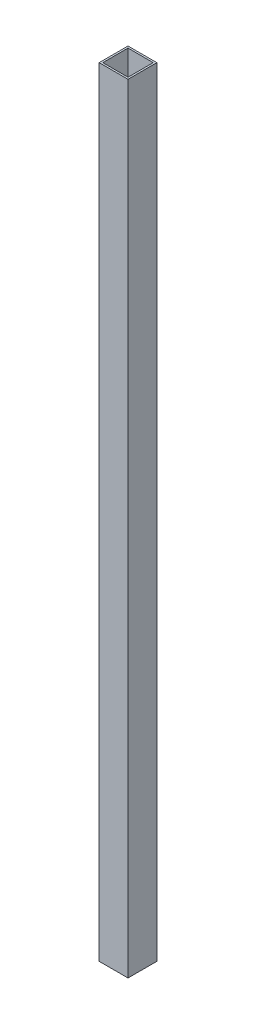
ISO-10303-21;
HEADER;
FILE_DESCRIPTION(('STEP AP214'),'2;1');
FILE_NAME('part.step','',(''),(''),'','','');
FILE_SCHEMA(('AUTOMOTIVE_DESIGN { 1 0 10303 214 1 1 1 1 }'));
ENDSEC;
DATA;
#1=APPLICATION_CONTEXT('core data for automotive mechanical design processes');
#2=APPLICATION_PROTOCOL_DEFINITION('international standard','automotive_design',2000,#1);
#3=PRODUCT_CONTEXT('',#1,'mechanical');
#4=PRODUCT('Part','Part','',(#3));
#5=PRODUCT_RELATED_PRODUCT_CATEGORY('part','',(#4));
#6=PRODUCT_DEFINITION_FORMATION('','',#4);
#7=PRODUCT_DEFINITION_CONTEXT('part definition',#1,'design');
#8=PRODUCT_DEFINITION('design','',#6,#7);
#9=PRODUCT_DEFINITION_SHAPE('','',#8);
#10=(LENGTH_UNIT() NAMED_UNIT(*) SI_UNIT(.MILLI.,.METRE.));
#11=(NAMED_UNIT(*) PLANE_ANGLE_UNIT() SI_UNIT($,.RADIAN.));
#12=(NAMED_UNIT(*) SI_UNIT($,.STERADIAN.) SOLID_ANGLE_UNIT());
#13=UNCERTAINTY_MEASURE_WITH_UNIT(LENGTH_MEASURE(1.E-05),#10,'distance_accuracy_value','');
#14=(GEOMETRIC_REPRESENTATION_CONTEXT(3) GLOBAL_UNCERTAINTY_ASSIGNED_CONTEXT((#13)) GLOBAL_UNIT_ASSIGNED_CONTEXT((#10,
#11,#12)) REPRESENTATION_CONTEXT('',''));
#15=CARTESIAN_POINT('',(0.,0.,0.));
#16=DIRECTION('',(0.,0.,1.));
#17=DIRECTION('',(1.,0.,0.));
#18=AXIS2_PLACEMENT_3D('',#15,#16,#17);
#19=CARTESIAN_POINT('',(0.,685.8,0.));
#20=DIRECTION('',(0.,-1.,0.));
#21=DIRECTION('',(0.,0.,-1.));
#22=AXIS2_PLACEMENT_3D('',#19,#20,#21);
#23=PLANE('',#22);
#24=DIRECTION('',(0.,0.,1.));
#25=VECTOR('',#24,1.);
#26=CARTESIAN_POINT('',(-12.7,685.8,-12.7));
#27=LINE('',#26,#25);
#28=CARTESIAN_POINT('',(-12.7,685.8,-12.7));
#29=VERTEX_POINT('',#28);
#30=CARTESIAN_POINT('',(-12.7,685.8,12.7));
#31=VERTEX_POINT('',#30);
#32=EDGE_CURVE('E134',#29,#31,#27,.T.);
#33=ORIENTED_EDGE('',*,*,#32,.T.);
#34=DIRECTION('',(1.,0.,0.));
#35=VECTOR('',#34,1.);
#36=CARTESIAN_POINT('',(12.7,685.8,12.7));
#37=LINE('',#36,#35);
#38=CARTESIAN_POINT('',(12.7,685.8,12.7));
#39=VERTEX_POINT('',#38);
#40=EDGE_CURVE('E137',#31,#39,#37,.T.);
#41=ORIENTED_EDGE('',*,*,#40,.T.);
#42=DIRECTION('',(0.,0.,-1.));
#43=VECTOR('',#42,1.);
#44=CARTESIAN_POINT('',(12.7,685.8,-12.7));
#45=LINE('',#44,#43);
#46=CARTESIAN_POINT('',(12.7,685.8,-12.7));
#47=VERTEX_POINT('',#46);
#48=EDGE_CURVE('E140',#39,#47,#45,.T.);
#49=ORIENTED_EDGE('',*,*,#48,.T.);
#50=DIRECTION('',(-1.,0.,0.));
#51=VECTOR('',#50,1.);
#52=CARTESIAN_POINT('',(12.7,685.8,-12.7));
#53=LINE('',#52,#51);
#54=EDGE_CURVE('E142',#47,#29,#53,.T.);
#55=ORIENTED_EDGE('',*,*,#54,.T.);
#56=EDGE_LOOP('',(#33,#41,#49,#55));
#57=FACE_BOUND('',#56,.T.);
#58=DIRECTION('',(0.,0.,1.));
#59=VECTOR('',#58,1.);
#60=CARTESIAN_POINT('',(-11.1125,685.8,-11.1125));
#61=LINE('',#60,#59);
#62=CARTESIAN_POINT('',(-11.1125,685.8,-11.1125));
#63=VERTEX_POINT('',#62);
#64=CARTESIAN_POINT('',(-11.1125,685.8,11.1125));
#65=VERTEX_POINT('',#64);
#66=EDGE_CURVE('E98',#63,#65,#61,.T.);
#67=ORIENTED_EDGE('',*,*,#66,.F.);
#68=DIRECTION('',(-1.,0.,0.));
#69=VECTOR('',#68,1.);
#70=CARTESIAN_POINT('',(11.1125,685.8,-11.1125));
#71=LINE('',#70,#69);
#72=CARTESIAN_POINT('',(11.1125,685.8,-11.1125));
#73=VERTEX_POINT('',#72);
#74=EDGE_CURVE('E120',#73,#63,#71,.T.);
#75=ORIENTED_EDGE('',*,*,#74,.F.);
#76=DIRECTION('',(0.,0.,-1.));
#77=VECTOR('',#76,1.);
#78=CARTESIAN_POINT('',(11.1125,685.8,-11.1125));
#79=LINE('',#78,#77);
#80=CARTESIAN_POINT('',(11.1125,685.8,11.1125));
#81=VERTEX_POINT('',#80);
#82=EDGE_CURVE('E118',#81,#73,#79,.T.);
#83=ORIENTED_EDGE('',*,*,#82,.F.);
#84=DIRECTION('',(1.,0.,0.));
#85=VECTOR('',#84,1.);
#86=CARTESIAN_POINT('',(11.1125,685.8,11.1125));
#87=LINE('',#86,#85);
#88=EDGE_CURVE('E106',#65,#81,#87,.T.);
#89=ORIENTED_EDGE('',*,*,#88,.F.);
#90=EDGE_LOOP('',(#67,#75,#83,#89));
#91=FACE_BOUND('',#90,.T.);
#92=ADVANCED_FACE('F33',(#57,#91),#23,.F.);
#93=CARTESIAN_POINT('',(0.,0.,0.));
#94=DIRECTION('',(0.,-1.,0.));
#95=DIRECTION('',(0.,0.,-1.));
#96=AXIS2_PLACEMENT_3D('',#93,#94,#95);
#97=PLANE('',#96);
#98=DIRECTION('',(0.,0.,1.));
#99=VECTOR('',#98,1.);
#100=CARTESIAN_POINT('',(-12.7,0.,-12.7));
#101=LINE('',#100,#99);
#102=CARTESIAN_POINT('',(-12.7,0.,-12.7));
#103=VERTEX_POINT('',#102);
#104=CARTESIAN_POINT('',(-12.7,0.,12.7));
#105=VERTEX_POINT('',#104);
#106=EDGE_CURVE('E114',#103,#105,#101,.T.);
#107=ORIENTED_EDGE('',*,*,#106,.F.);
#108=DIRECTION('',(-1.,0.,0.));
#109=VECTOR('',#108,1.);
#110=CARTESIAN_POINT('',(12.7,0.,-12.7));
#111=LINE('',#110,#109);
#112=CARTESIAN_POINT('',(12.7,0.,-12.7));
#113=VERTEX_POINT('',#112);
#114=EDGE_CURVE('E138',#113,#103,#111,.T.);
#115=ORIENTED_EDGE('',*,*,#114,.F.);
#116=DIRECTION('',(0.,0.,-1.));
#117=VECTOR('',#116,1.);
#118=CARTESIAN_POINT('',(12.7,0.,-12.7));
#119=LINE('',#118,#117);
#120=CARTESIAN_POINT('',(12.7,0.,12.7));
#121=VERTEX_POINT('',#120);
#122=EDGE_CURVE('E149',#121,#113,#119,.T.);
#123=ORIENTED_EDGE('',*,*,#122,.F.);
#124=DIRECTION('',(1.,0.,0.));
#125=VECTOR('',#124,1.);
#126=CARTESIAN_POINT('',(12.7,0.,12.7));
#127=LINE('',#126,#125);
#128=EDGE_CURVE('E147',#105,#121,#127,.T.);
#129=ORIENTED_EDGE('',*,*,#128,.F.);
#130=EDGE_LOOP('',(#107,#115,#123,#129));
#131=FACE_BOUND('',#130,.T.);
#132=DIRECTION('',(-1.,0.,0.));
#133=VECTOR('',#132,1.);
#134=CARTESIAN_POINT('',(11.1125,0.,-11.1125));
#135=LINE('',#134,#133);
#136=CARTESIAN_POINT('',(11.1125,0.,-11.1125));
#137=VERTEX_POINT('',#136);
#138=CARTESIAN_POINT('',(-11.1125,0.,-11.1125));
#139=VERTEX_POINT('',#138);
#140=EDGE_CURVE('E107',#137,#139,#135,.T.);
#141=ORIENTED_EDGE('',*,*,#140,.T.);
#142=DIRECTION('',(0.,0.,1.));
#143=VECTOR('',#142,1.);
#144=CARTESIAN_POINT('',(-11.1125,0.,-11.1125));
#145=LINE('',#144,#143);
#146=CARTESIAN_POINT('',(-11.1125,0.,11.1125));
#147=VERTEX_POINT('',#146);
#148=EDGE_CURVE('E56',#139,#147,#145,.T.);
#149=ORIENTED_EDGE('',*,*,#148,.T.);
#150=DIRECTION('',(1.,0.,0.));
#151=VECTOR('',#150,1.);
#152=CARTESIAN_POINT('',(11.1125,0.,11.1125));
#153=LINE('',#152,#151);
#154=CARTESIAN_POINT('',(11.1125,0.,11.1125));
#155=VERTEX_POINT('',#154);
#156=EDGE_CURVE('E113',#147,#155,#153,.T.);
#157=ORIENTED_EDGE('',*,*,#156,.T.);
#158=DIRECTION('',(0.,0.,-1.));
#159=VECTOR('',#158,1.);
#160=CARTESIAN_POINT('',(11.1125,0.,-11.1125));
#161=LINE('',#160,#159);
#162=EDGE_CURVE('E126',#155,#137,#161,.T.);
#163=ORIENTED_EDGE('',*,*,#162,.T.);
#164=EDGE_LOOP('',(#141,#149,#157,#163));
#165=FACE_BOUND('',#164,.T.);
#166=ADVANCED_FACE('F167',(#131,#165),#97,.T.);
#167=CARTESIAN_POINT('',(-12.7,685.8,-12.7));
#168=DIRECTION('',(1.,0.,0.));
#169=DIRECTION('',(0.,0.,-1.));
#170=AXIS2_PLACEMENT_3D('',#167,#168,#169);
#171=PLANE('',#170);
#172=ORIENTED_EDGE('',*,*,#106,.T.);
#173=DIRECTION('',(0.,-1.,0.));
#174=VECTOR('',#173,1.);
#175=CARTESIAN_POINT('',(-12.7,685.8,12.7));
#176=LINE('',#175,#174);
#177=EDGE_CURVE('E11',#31,#105,#176,.T.);
#178=ORIENTED_EDGE('',*,*,#177,.F.);
#179=ORIENTED_EDGE('',*,*,#32,.F.);
#180=DIRECTION('',(0.,-1.,0.));
#181=VECTOR('',#180,1.);
#182=CARTESIAN_POINT('',(-12.7,685.8,-12.7));
#183=LINE('',#182,#181);
#184=EDGE_CURVE('E144',#29,#103,#183,.T.);
#185=ORIENTED_EDGE('',*,*,#184,.T.);
#186=EDGE_LOOP('',(#172,#178,#179,#185));
#187=FACE_BOUND('',#186,.T.);
#188=ADVANCED_FACE('F35',(#187),#171,.F.);
#189=CARTESIAN_POINT('',(12.7,685.8,12.7));
#190=DIRECTION('',(0.,0.,-1.));
#191=DIRECTION('',(-1.,0.,0.));
#192=AXIS2_PLACEMENT_3D('',#189,#190,#191);
#193=PLANE('',#192);
#194=ORIENTED_EDGE('',*,*,#128,.T.);
#195=DIRECTION('',(0.,-1.,0.));
#196=VECTOR('',#195,1.);
#197=CARTESIAN_POINT('',(12.7,685.8,12.7));
#198=LINE('',#197,#196);
#199=EDGE_CURVE('E41',#39,#121,#198,.T.);
#200=ORIENTED_EDGE('',*,*,#199,.F.);
#201=ORIENTED_EDGE('',*,*,#40,.F.);
#202=ORIENTED_EDGE('',*,*,#177,.T.);
#203=EDGE_LOOP('',(#194,#200,#201,#202));
#204=FACE_BOUND('',#203,.T.);
#205=ADVANCED_FACE('F177',(#204),#193,.F.);
#206=CARTESIAN_POINT('',(12.7,685.8,-12.7));
#207=DIRECTION('',(-1.,0.,0.));
#208=DIRECTION('',(0.,0.,1.));
#209=AXIS2_PLACEMENT_3D('',#206,#207,#208);
#210=PLANE('',#209);
#211=ORIENTED_EDGE('',*,*,#122,.T.);
#212=DIRECTION('',(0.,-1.,0.));
#213=VECTOR('',#212,1.);
#214=CARTESIAN_POINT('',(12.7,685.8,-12.7));
#215=LINE('',#214,#213);
#216=EDGE_CURVE('E154',#47,#113,#215,.T.);
#217=ORIENTED_EDGE('',*,*,#216,.F.);
#218=ORIENTED_EDGE('',*,*,#48,.F.);
#219=ORIENTED_EDGE('',*,*,#199,.T.);
#220=EDGE_LOOP('',(#211,#217,#218,#219));
#221=FACE_BOUND('',#220,.T.);
#222=ADVANCED_FACE('F161',(#221),#210,.F.);
#223=CARTESIAN_POINT('',(12.7,685.8,-12.7));
#224=DIRECTION('',(0.,0.,1.));
#225=DIRECTION('',(1.,0.,0.));
#226=AXIS2_PLACEMENT_3D('',#223,#224,#225);
#227=PLANE('',#226);
#228=ORIENTED_EDGE('',*,*,#114,.T.);
#229=ORIENTED_EDGE('',*,*,#184,.F.);
#230=ORIENTED_EDGE('',*,*,#54,.F.);
#231=ORIENTED_EDGE('',*,*,#216,.T.);
#232=EDGE_LOOP('',(#228,#229,#230,#231));
#233=FACE_BOUND('',#232,.T.);
#234=ADVANCED_FACE('F171',(#233),#227,.F.);
#235=CARTESIAN_POINT('',(-11.1125,685.8,-11.1125));
#236=DIRECTION('',(1.,0.,0.));
#237=DIRECTION('',(0.,0.,-1.));
#238=AXIS2_PLACEMENT_3D('',#235,#236,#237);
#239=PLANE('',#238);
#240=ORIENTED_EDGE('',*,*,#148,.F.);
#241=DIRECTION('',(0.,-1.,0.));
#242=VECTOR('',#241,1.);
#243=CARTESIAN_POINT('',(-11.1125,685.8,-11.1125));
#244=LINE('',#243,#242);
#245=EDGE_CURVE('E102',#63,#139,#244,.T.);
#246=ORIENTED_EDGE('',*,*,#245,.F.);
#247=ORIENTED_EDGE('',*,*,#66,.T.);
#248=DIRECTION('',(0.,-1.,0.));
#249=VECTOR('',#248,1.);
#250=CARTESIAN_POINT('',(-11.1125,685.8,11.1125));
#251=LINE('',#250,#249);
#252=EDGE_CURVE('E101',#65,#147,#251,.T.);
#253=ORIENTED_EDGE('',*,*,#252,.T.);
#254=EDGE_LOOP('',(#240,#246,#247,#253));
#255=FACE_BOUND('',#254,.T.);
#256=ADVANCED_FACE('F100',(#255),#239,.T.);
#257=CARTESIAN_POINT('',(11.1125,685.8,11.1125));
#258=DIRECTION('',(0.,0.,-1.));
#259=DIRECTION('',(-1.,0.,0.));
#260=AXIS2_PLACEMENT_3D('',#257,#258,#259);
#261=PLANE('',#260);
#262=ORIENTED_EDGE('',*,*,#156,.F.);
#263=ORIENTED_EDGE('',*,*,#252,.F.);
#264=ORIENTED_EDGE('',*,*,#88,.T.);
#265=DIRECTION('',(0.,-1.,0.));
#266=VECTOR('',#265,1.);
#267=CARTESIAN_POINT('',(11.1125,685.8,11.1125));
#268=LINE('',#267,#266);
#269=EDGE_CURVE('E115',#81,#155,#268,.T.);
#270=ORIENTED_EDGE('',*,*,#269,.T.);
#271=EDGE_LOOP('',(#262,#263,#264,#270));
#272=FACE_BOUND('',#271,.T.);
#273=ADVANCED_FACE('F110',(#272),#261,.T.);
#274=CARTESIAN_POINT('',(11.1125,685.8,-11.1125));
#275=DIRECTION('',(-1.,0.,0.));
#276=DIRECTION('',(0.,0.,1.));
#277=AXIS2_PLACEMENT_3D('',#274,#275,#276);
#278=PLANE('',#277);
#279=ORIENTED_EDGE('',*,*,#162,.F.);
#280=ORIENTED_EDGE('',*,*,#269,.F.);
#281=ORIENTED_EDGE('',*,*,#82,.T.);
#282=DIRECTION('',(0.,-1.,0.));
#283=VECTOR('',#282,1.);
#284=CARTESIAN_POINT('',(11.1125,685.8,-11.1125));
#285=LINE('',#284,#283);
#286=EDGE_CURVE('E48',#73,#137,#285,.T.);
#287=ORIENTED_EDGE('',*,*,#286,.T.);
#288=EDGE_LOOP('',(#279,#280,#281,#287));
#289=FACE_BOUND('',#288,.T.);
#290=ADVANCED_FACE('F200',(#289),#278,.T.);
#291=CARTESIAN_POINT('',(11.1125,685.8,-11.1125));
#292=DIRECTION('',(0.,0.,1.));
#293=DIRECTION('',(1.,0.,0.));
#294=AXIS2_PLACEMENT_3D('',#291,#292,#293);
#295=PLANE('',#294);
#296=ORIENTED_EDGE('',*,*,#140,.F.);
#297=ORIENTED_EDGE('',*,*,#286,.F.);
#298=ORIENTED_EDGE('',*,*,#74,.T.);
#299=ORIENTED_EDGE('',*,*,#245,.T.);
#300=EDGE_LOOP('',(#296,#297,#298,#299));
#301=FACE_BOUND('',#300,.T.);
#302=ADVANCED_FACE('F204',(#301),#295,.T.);
#303=CLOSED_SHELL('',(#92,#166,#188,#205,#222,#234,#256,#273,#290,#302));
#304=MANIFOLD_SOLID_BREP('B2',#303);
#305=ADVANCED_BREP_SHAPE_REPRESENTATION('',(#18,#304),#14);
#306=SHAPE_DEFINITION_REPRESENTATION(#9,#305);
ENDSEC;
END-ISO-10303-21;
